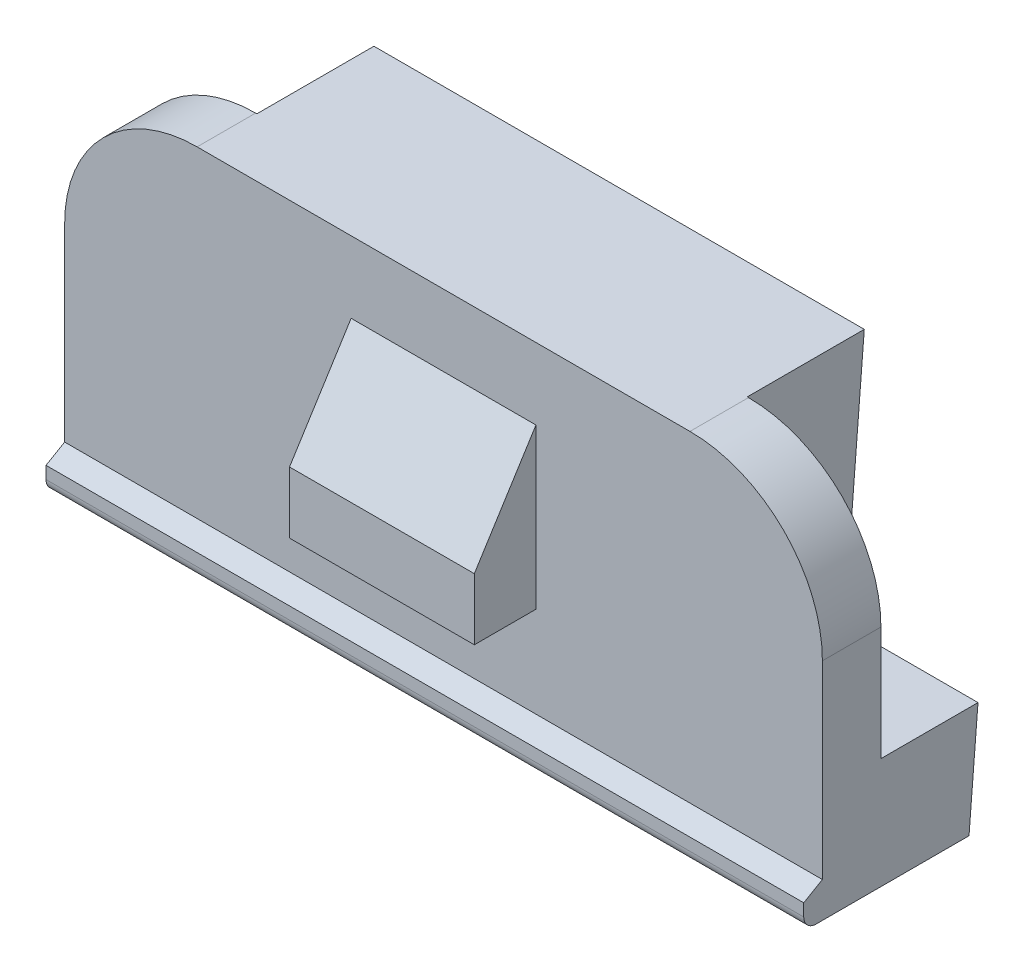
ISO-10303-21;
HEADER;
FILE_DESCRIPTION(('STEP AP214'),'2;1');
FILE_NAME('part.step','',(''),(''),'','','');
FILE_SCHEMA(('AUTOMOTIVE_DESIGN { 1 0 10303 214 1 1 1 1 }'));
ENDSEC;
DATA;
#1=APPLICATION_CONTEXT('core data for automotive mechanical design processes');
#2=APPLICATION_PROTOCOL_DEFINITION('international standard','automotive_design',2000,#1);
#3=PRODUCT_CONTEXT('',#1,'mechanical');
#4=PRODUCT('Part','Part','',(#3));
#5=PRODUCT_RELATED_PRODUCT_CATEGORY('part','',(#4));
#6=PRODUCT_DEFINITION_FORMATION('','',#4);
#7=PRODUCT_DEFINITION_CONTEXT('part definition',#1,'design');
#8=PRODUCT_DEFINITION('design','',#6,#7);
#9=PRODUCT_DEFINITION_SHAPE('','',#8);
#10=(LENGTH_UNIT() NAMED_UNIT(*) SI_UNIT(.MILLI.,.METRE.));
#11=(NAMED_UNIT(*) PLANE_ANGLE_UNIT() SI_UNIT($,.RADIAN.));
#12=(NAMED_UNIT(*) SI_UNIT($,.STERADIAN.) SOLID_ANGLE_UNIT());
#13=UNCERTAINTY_MEASURE_WITH_UNIT(LENGTH_MEASURE(1.E-05),#10,'distance_accuracy_value','');
#14=(GEOMETRIC_REPRESENTATION_CONTEXT(3) GLOBAL_UNCERTAINTY_ASSIGNED_CONTEXT((#13)) GLOBAL_UNIT_ASSIGNED_CONTEXT((#10,
#11,#12)) REPRESENTATION_CONTEXT('',''));
#15=CARTESIAN_POINT('',(0.,0.,0.));
#16=DIRECTION('',(0.,0.,1.));
#17=DIRECTION('',(1.,0.,0.));
#18=AXIS2_PLACEMENT_3D('',#15,#16,#17);
#19=CARTESIAN_POINT('',(12.3,0.574999999999999,-0.303108891324554));
#20=DIRECTION('',(0.,0.,-1.));
#21=DIRECTION('',(0.,1.,0.));
#22=AXIS2_PLACEMENT_3D('',#19,#20,#21);
#23=PLANE('',#22);
#24=DIRECTION('',(0.,-1.,0.));
#25=VECTOR('',#24,1.);
#26=CARTESIAN_POINT('',(12.3,0.574999999999999,-0.303108891324554));
#27=LINE('',#26,#25);
#28=CARTESIAN_POINT('',(12.3,3.65,-0.303108891324554));
#29=VERTEX_POINT('',#28);
#30=CARTESIAN_POINT('',(12.3,0.574999999999999,-0.303108891324554));
#31=VERTEX_POINT('',#30);
#32=EDGE_CURVE('E200',#29,#31,#27,.T.);
#33=ORIENTED_EDGE('',*,*,#32,.F.);
#34=CARTESIAN_POINT('',(10.15,3.65,-0.303108891324554));
#35=DIRECTION('',(0.,0.,-1.));
#36=DIRECTION('',(0.,1.,0.));
#37=AXIS2_PLACEMENT_3D('',#34,#35,#36);
#38=CIRCLE('',#37,2.15);
#39=CARTESIAN_POINT('',(10.15,5.8,-0.303108891324554));
#40=VERTEX_POINT('',#39);
#41=EDGE_CURVE('E215',#29,#40,#38,.F.);
#42=ORIENTED_EDGE('',*,*,#41,.T.);
#43=DIRECTION('',(-1.,0.,0.));
#44=VECTOR('',#43,1.);
#45=CARTESIAN_POINT('',(12.3,5.8,-0.303108891324554));
#46=LINE('',#45,#44);
#47=CARTESIAN_POINT('',(2.15,5.8,-0.303108891324554));
#48=VERTEX_POINT('',#47);
#49=EDGE_CURVE('E199',#40,#48,#46,.T.);
#50=ORIENTED_EDGE('',*,*,#49,.T.);
#51=CARTESIAN_POINT('',(2.15,3.65,-0.303108891324554));
#52=DIRECTION('',(0.,0.,-1.));
#53=DIRECTION('',(0.,1.,0.));
#54=AXIS2_PLACEMENT_3D('',#51,#52,#53);
#55=CIRCLE('',#54,2.15);
#56=CARTESIAN_POINT('',(0.,3.65,-0.303108891324554));
#57=VERTEX_POINT('',#56);
#58=EDGE_CURVE('E213',#48,#57,#55,.F.);
#59=ORIENTED_EDGE('',*,*,#58,.T.);
#60=DIRECTION('',(0.,-1.,0.));
#61=VECTOR('',#60,1.);
#62=CARTESIAN_POINT('',(0.,0.574999999999999,-0.303108891324554));
#63=LINE('',#62,#61);
#64=CARTESIAN_POINT('',(0.,0.574999999999999,-0.303108891324554));
#65=VERTEX_POINT('',#64);
#66=EDGE_CURVE('E187',#57,#65,#63,.T.);
#67=ORIENTED_EDGE('',*,*,#66,.T.);
#68=DIRECTION('',(-1.,0.,0.));
#69=VECTOR('',#68,1.);
#70=CARTESIAN_POINT('',(12.3,0.574999999999999,-0.303108891324554));
#71=LINE('',#70,#69);
#72=EDGE_CURVE('E196',#31,#65,#71,.T.);
#73=ORIENTED_EDGE('',*,*,#72,.F.);
#74=EDGE_LOOP('',(#33,#42,#50,#59,#67,#73));
#75=FACE_BOUND('',#74,.T.);
#76=DIRECTION('',(1.,0.,0.));
#77=VECTOR('',#76,1.);
#78=CARTESIAN_POINT('',(2.77167627923193,4.64,-0.303108891324554));
#79=LINE('',#78,#77);
#80=CARTESIAN_POINT('',(4.65,4.64,-0.303108891324554));
#81=VERTEX_POINT('',#80);
#82=CARTESIAN_POINT('',(7.65,4.64,-0.303108891324554));
#83=VERTEX_POINT('',#82);
#84=EDGE_CURVE('E317',#81,#83,#79,.T.);
#85=ORIENTED_EDGE('',*,*,#84,.T.);
#86=DIRECTION('',(0.,1.,0.));
#87=VECTOR('',#86,1.);
#88=CARTESIAN_POINT('',(7.65,3.05,-0.303108891324554));
#89=LINE('',#88,#87);
#90=CARTESIAN_POINT('',(7.65,2.05,-0.303108891324554));
#91=VERTEX_POINT('',#90);
#92=EDGE_CURVE('E306',#91,#83,#89,.T.);
#93=ORIENTED_EDGE('',*,*,#92,.F.);
#94=DIRECTION('',(1.,0.,0.));
#95=VECTOR('',#94,1.);
#96=CARTESIAN_POINT('',(4.65,2.05,-0.303108891324554));
#97=LINE('',#96,#95);
#98=CARTESIAN_POINT('',(4.65,2.05,-0.303108891324554));
#99=VERTEX_POINT('',#98);
#100=EDGE_CURVE('E55',#99,#91,#97,.T.);
#101=ORIENTED_EDGE('',*,*,#100,.F.);
#102=DIRECTION('',(0.,-1.,0.));
#103=VECTOR('',#102,1.);
#104=CARTESIAN_POINT('',(4.65,3.05,-0.303108891324554));
#105=LINE('',#104,#103);
#106=EDGE_CURVE('E304',#81,#99,#105,.T.);
#107=ORIENTED_EDGE('',*,*,#106,.F.);
#108=EDGE_LOOP('',(#85,#93,#101,#107));
#109=FACE_BOUND('',#108,.T.);
#110=ADVANCED_FACE('F33',(#75,#109),#23,.F.);
#111=CARTESIAN_POINT('',(12.3,0.4,0.));
#112=DIRECTION('',(0.,-0.86602540378444,-0.499999999999998));
#113=DIRECTION('',(0.,0.499999999999998,-0.86602540378444));
#114=AXIS2_PLACEMENT_3D('',#111,#112,#113);
#115=PLANE('',#114);
#116=DIRECTION('',(0.,-0.499999999999998,0.86602540378444));
#117=VECTOR('',#116,1.);
#118=CARTESIAN_POINT('',(0.,0.4,0.));
#119=LINE('',#118,#117);
#120=CARTESIAN_POINT('',(0.,0.4,0.));
#121=VERTEX_POINT('',#120);
#122=EDGE_CURVE('E253',#65,#121,#119,.T.);
#123=ORIENTED_EDGE('',*,*,#122,.T.);
#124=DIRECTION('',(-1.,0.,0.));
#125=VECTOR('',#124,1.);
#126=CARTESIAN_POINT('',(12.3,0.4,0.));
#127=LINE('',#126,#125);
#128=CARTESIAN_POINT('',(12.3,0.4,0.));
#129=VERTEX_POINT('',#128);
#130=EDGE_CURVE('E207',#129,#121,#127,.T.);
#131=ORIENTED_EDGE('',*,*,#130,.F.);
#132=DIRECTION('',(0.,-0.499999999999998,0.86602540378444));
#133=VECTOR('',#132,1.);
#134=CARTESIAN_POINT('',(12.3,0.4,0.));
#135=LINE('',#134,#133);
#136=EDGE_CURVE('E190',#31,#129,#135,.T.);
#137=ORIENTED_EDGE('',*,*,#136,.F.);
#138=ORIENTED_EDGE('',*,*,#72,.T.);
#139=EDGE_LOOP('',(#123,#131,#137,#138));
#140=FACE_BOUND('',#139,.T.);
#141=ADVANCED_FACE('F350',(#140),#115,.F.);
#142=CARTESIAN_POINT('',(12.3,0.200000000000001,0.));
#143=DIRECTION('',(0.,0.,-1.));
#144=DIRECTION('',(-1.,0.,0.));
#145=AXIS2_PLACEMENT_3D('',#142,#143,#144);
#146=PLANE('',#145);
#147=DIRECTION('',(0.,-1.,0.));
#148=VECTOR('',#147,1.);
#149=CARTESIAN_POINT('',(0.,0.200000000000001,0.));
#150=LINE('',#149,#148);
#151=CARTESIAN_POINT('',(0.,0.200000000000001,0.));
#152=VERTEX_POINT('',#151);
#153=EDGE_CURVE('E192',#121,#152,#150,.T.);
#154=ORIENTED_EDGE('',*,*,#153,.T.);
#155=DIRECTION('',(-1.,0.,0.));
#156=VECTOR('',#155,1.);
#157=CARTESIAN_POINT('',(12.3,0.200000000000001,0.));
#158=LINE('',#157,#156);
#159=CARTESIAN_POINT('',(12.3,0.200000000000001,0.));
#160=VERTEX_POINT('',#159);
#161=EDGE_CURVE('E204',#160,#152,#158,.T.);
#162=ORIENTED_EDGE('',*,*,#161,.F.);
#163=DIRECTION('',(0.,-1.,0.));
#164=VECTOR('',#163,1.);
#165=CARTESIAN_POINT('',(12.3,0.200000000000001,0.));
#166=LINE('',#165,#164);
#167=EDGE_CURVE('E265',#129,#160,#166,.T.);
#168=ORIENTED_EDGE('',*,*,#167,.F.);
#169=ORIENTED_EDGE('',*,*,#130,.T.);
#170=EDGE_LOOP('',(#154,#162,#168,#169));
#171=FACE_BOUND('',#170,.T.);
#172=ADVANCED_FACE('F354',(#171),#146,.F.);
#173=CARTESIAN_POINT('',(12.3,0.2,-0.2));
#174=DIRECTION('',(-1.,0.,0.));
#175=DIRECTION('',(0.,0.,1.));
#176=AXIS2_PLACEMENT_3D('',#173,#174,#175);
#177=CYLINDRICAL_SURFACE('',#176,0.2);
#178=CARTESIAN_POINT('',(0.,0.2,-0.2));
#179=DIRECTION('',(1.,0.,0.));
#180=DIRECTION('',(0.,0.,-1.));
#181=AXIS2_PLACEMENT_3D('',#178,#179,#180);
#182=CIRCLE('',#181,0.2);
#183=CARTESIAN_POINT('',(0.,0.,-0.200000000000001));
#184=VERTEX_POINT('',#183);
#185=EDGE_CURVE('E188',#152,#184,#182,.T.);
#186=ORIENTED_EDGE('',*,*,#185,.T.);
#187=DIRECTION('',(-1.,0.,0.));
#188=VECTOR('',#187,1.);
#189=CARTESIAN_POINT('',(12.3,0.,-0.200000000000001));
#190=LINE('',#189,#188);
#191=CARTESIAN_POINT('',(12.3,0.,-0.200000000000001));
#192=VERTEX_POINT('',#191);
#193=EDGE_CURVE('E186',#192,#184,#190,.T.);
#194=ORIENTED_EDGE('',*,*,#193,.F.);
#195=CARTESIAN_POINT('',(12.3,0.2,-0.2));
#196=DIRECTION('',(1.,0.,0.));
#197=DIRECTION('',(0.,0.,-1.));
#198=AXIS2_PLACEMENT_3D('',#195,#196,#197);
#199=CIRCLE('',#198,0.2);
#200=EDGE_CURVE('E263',#160,#192,#199,.T.);
#201=ORIENTED_EDGE('',*,*,#200,.F.);
#202=ORIENTED_EDGE('',*,*,#161,.T.);
#203=EDGE_LOOP('',(#186,#194,#201,#202));
#204=FACE_BOUND('',#203,.T.);
#205=ADVANCED_FACE('F356',(#204),#177,.T.);
#206=CARTESIAN_POINT('',(12.3,0.,-3.30310889132455));
#207=DIRECTION('',(0.,1.,0.));
#208=DIRECTION('',(0.,0.,1.));
#209=AXIS2_PLACEMENT_3D('',#206,#207,#208);
#210=PLANE('',#209);
#211=DIRECTION('',(0.,0.,-1.));
#212=VECTOR('',#211,1.);
#213=CARTESIAN_POINT('',(0.,0.,-3.30310889132455));
#214=LINE('',#213,#212);
#215=CARTESIAN_POINT('',(0.,0.,-2.68310889132455));
#216=VERTEX_POINT('',#215);
#217=EDGE_CURVE('E179',#184,#216,#214,.T.);
#218=ORIENTED_EDGE('',*,*,#217,.T.);
#219=DIRECTION('',(1.,0.,0.));
#220=VECTOR('',#219,1.);
#221=CARTESIAN_POINT('',(0.,0.,-2.68310889132455));
#222=LINE('',#221,#220);
#223=CARTESIAN_POINT('',(12.3,0.,-2.68310889132455));
#224=VERTEX_POINT('',#223);
#225=EDGE_CURVE('E161',#216,#224,#222,.T.);
#226=ORIENTED_EDGE('',*,*,#225,.T.);
#227=DIRECTION('',(0.,0.,-1.));
#228=VECTOR('',#227,1.);
#229=CARTESIAN_POINT('',(12.3,0.,-3.30310889132455));
#230=LINE('',#229,#228);
#231=EDGE_CURVE('E261',#192,#224,#230,.T.);
#232=ORIENTED_EDGE('',*,*,#231,.F.);
#233=ORIENTED_EDGE('',*,*,#193,.T.);
#234=EDGE_LOOP('',(#218,#226,#232,#233));
#235=FACE_BOUND('',#234,.T.);
#236=ADVANCED_FACE('F184',(#235),#210,.F.);
#237=CARTESIAN_POINT('',(12.3,5.8,-0.303108891324554));
#238=DIRECTION('',(0.,-1.,0.));
#239=DIRECTION('',(0.,0.,-1.));
#240=AXIS2_PLACEMENT_3D('',#237,#238,#239);
#241=PLANE('',#240);
#242=DIRECTION('',(0.,0.,1.));
#243=VECTOR('',#242,1.);
#244=CARTESIAN_POINT('',(10.13,5.8,-3.30310889132455));
#245=LINE('',#244,#243);
#246=CARTESIAN_POINT('',(10.13,5.8,-3.15310889132455));
#247=VERTEX_POINT('',#246);
#248=CARTESIAN_POINT('',(10.13,5.8,-1.25310889132455));
#249=VERTEX_POINT('',#248);
#250=EDGE_CURVE('E288',#247,#249,#245,.T.);
#251=ORIENTED_EDGE('',*,*,#250,.F.);
#252=DIRECTION('',(1.,0.,0.));
#253=VECTOR('',#252,1.);
#254=CARTESIAN_POINT('',(0.,5.8,-3.15310889132455));
#255=LINE('',#254,#253);
#256=CARTESIAN_POINT('',(2.17,5.8,-3.15310889132455));
#257=VERTEX_POINT('',#256);
#258=EDGE_CURVE('E172',#257,#247,#255,.T.);
#259=ORIENTED_EDGE('',*,*,#258,.F.);
#260=DIRECTION('',(0.,0.,-1.));
#261=VECTOR('',#260,1.);
#262=CARTESIAN_POINT('',(2.17,5.8,-3.30310889132455));
#263=LINE('',#262,#261);
#264=CARTESIAN_POINT('',(2.17,5.8,-1.25310889132455));
#265=VERTEX_POINT('',#264);
#266=EDGE_CURVE('E244',#265,#257,#263,.T.);
#267=ORIENTED_EDGE('',*,*,#266,.F.);
#268=DIRECTION('',(1.,0.,0.));
#269=VECTOR('',#268,1.);
#270=CARTESIAN_POINT('',(0.,5.8,-1.25310889132455));
#271=LINE('',#270,#269);
#272=CARTESIAN_POINT('',(2.15,5.8,-1.25310889132455));
#273=VERTEX_POINT('',#272);
#274=EDGE_CURVE('E230',#273,#265,#271,.T.);
#275=ORIENTED_EDGE('',*,*,#274,.F.);
#276=DIRECTION('',(0.,0.,1.));
#277=VECTOR('',#276,1.);
#278=CARTESIAN_POINT('',(2.15,5.8,-0.303108891324554));
#279=LINE('',#278,#277);
#280=EDGE_CURVE('E217',#273,#48,#279,.T.);
#281=ORIENTED_EDGE('',*,*,#280,.T.);
#282=ORIENTED_EDGE('',*,*,#49,.F.);
#283=DIRECTION('',(0.,0.,1.));
#284=VECTOR('',#283,1.);
#285=CARTESIAN_POINT('',(10.15,5.8,-1.25310889132455));
#286=LINE('',#285,#284);
#287=CARTESIAN_POINT('',(10.15,5.8,-1.25310889132455));
#288=VERTEX_POINT('',#287);
#289=EDGE_CURVE('E220',#40,#288,#286,.F.);
#290=ORIENTED_EDGE('',*,*,#289,.T.);
#291=DIRECTION('',(1.,0.,0.));
#292=VECTOR('',#291,1.);
#293=CARTESIAN_POINT('',(12.3,5.8,-1.25310889132455));
#294=LINE('',#293,#292);
#295=EDGE_CURVE('E284',#249,#288,#294,.T.);
#296=ORIENTED_EDGE('',*,*,#295,.F.);
#297=EDGE_LOOP('',(#251,#259,#267,#275,#281,#282,#290,#296));
#298=FACE_BOUND('',#297,.T.);
#299=ADVANCED_FACE('F240',(#298),#241,.F.);
#300=CARTESIAN_POINT('',(12.3,0.2,-0.2));
#301=DIRECTION('',(1.,0.,0.));
#302=DIRECTION('',(0.,0.,-1.));
#303=AXIS2_PLACEMENT_3D('',#300,#301,#302);
#304=PLANE('',#303);
#305=DIRECTION('',(0.,-0.9967327883488,0.0807697259524028));
#306=VECTOR('',#305,1.);
#307=CARTESIAN_POINT('',(12.3,0.,-2.68310889132455));
#308=LINE('',#307,#306);
#309=CARTESIAN_POINT('',(12.3,1.8,-2.82897096029007));
#310=VERTEX_POINT('',#309);
#311=EDGE_CURVE('E167',#310,#224,#308,.T.);
#312=ORIENTED_EDGE('',*,*,#311,.F.);
#313=DIRECTION('',(0.,0.,-1.));
#314=VECTOR('',#313,1.);
#315=CARTESIAN_POINT('',(12.3,1.8,-3.30310889132455));
#316=LINE('',#315,#314);
#317=CARTESIAN_POINT('',(12.3,1.8,-1.25310889132455));
#318=VERTEX_POINT('',#317);
#319=EDGE_CURVE('E287',#318,#310,#316,.T.);
#320=ORIENTED_EDGE('',*,*,#319,.F.);
#321=DIRECTION('',(0.,1.,0.));
#322=VECTOR('',#321,1.);
#323=CARTESIAN_POINT('',(12.3,1.8,-1.25310889132455));
#324=LINE('',#323,#322);
#325=CARTESIAN_POINT('',(12.3,3.65,-1.25310889132455));
#326=VERTEX_POINT('',#325);
#327=EDGE_CURVE('E245',#318,#326,#324,.T.);
#328=ORIENTED_EDGE('',*,*,#327,.T.);
#329=DIRECTION('',(0.,0.,1.));
#330=VECTOR('',#329,1.);
#331=CARTESIAN_POINT('',(12.3,3.65,-0.303108891324554));
#332=LINE('',#331,#330);
#333=EDGE_CURVE('E210',#326,#29,#332,.T.);
#334=ORIENTED_EDGE('',*,*,#333,.T.);
#335=ORIENTED_EDGE('',*,*,#32,.T.);
#336=ORIENTED_EDGE('',*,*,#136,.T.);
#337=ORIENTED_EDGE('',*,*,#167,.T.);
#338=ORIENTED_EDGE('',*,*,#200,.T.);
#339=ORIENTED_EDGE('',*,*,#231,.T.);
#340=EDGE_LOOP('',(#312,#320,#328,#334,#335,#336,#337,#338,#339));
#341=FACE_BOUND('',#340,.T.);
#342=ADVANCED_FACE('F347',(#341),#304,.T.);
#343=CARTESIAN_POINT('',(0.,0.2,-0.2));
#344=DIRECTION('',(1.,0.,0.));
#345=DIRECTION('',(0.,0.,-1.));
#346=AXIS2_PLACEMENT_3D('',#343,#344,#345);
#347=PLANE('',#346);
#348=DIRECTION('',(0.,0.,1.));
#349=VECTOR('',#348,1.);
#350=CARTESIAN_POINT('',(0.,1.8,-3.30310889132455));
#351=LINE('',#350,#349);
#352=CARTESIAN_POINT('',(0.,1.8,-2.82897096029007));
#353=VERTEX_POINT('',#352);
#354=CARTESIAN_POINT('',(0.,1.8,-1.25310889132455));
#355=VERTEX_POINT('',#354);
#356=EDGE_CURVE('E181',#353,#355,#351,.T.);
#357=ORIENTED_EDGE('',*,*,#356,.F.);
#358=DIRECTION('',(0.,-0.9967327883488,0.0807697259524028));
#359=VECTOR('',#358,1.);
#360=CARTESIAN_POINT('',(0.,0.,-2.68310889132455));
#361=LINE('',#360,#359);
#362=EDGE_CURVE('E164',#353,#216,#361,.T.);
#363=ORIENTED_EDGE('',*,*,#362,.T.);
#364=ORIENTED_EDGE('',*,*,#217,.F.);
#365=ORIENTED_EDGE('',*,*,#185,.F.);
#366=ORIENTED_EDGE('',*,*,#153,.F.);
#367=ORIENTED_EDGE('',*,*,#122,.F.);
#368=ORIENTED_EDGE('',*,*,#66,.F.);
#369=DIRECTION('',(0.,0.,1.));
#370=VECTOR('',#369,1.);
#371=CARTESIAN_POINT('',(0.,3.65,-0.2));
#372=LINE('',#371,#370);
#373=CARTESIAN_POINT('',(0.,3.65,-1.25310889132455));
#374=VERTEX_POINT('',#373);
#375=EDGE_CURVE('E224',#57,#374,#372,.F.);
#376=ORIENTED_EDGE('',*,*,#375,.T.);
#377=DIRECTION('',(0.,1.,0.));
#378=VECTOR('',#377,1.);
#379=CARTESIAN_POINT('',(0.,1.8,-1.25310889132455));
#380=LINE('',#379,#378);
#381=EDGE_CURVE('E233',#355,#374,#380,.T.);
#382=ORIENTED_EDGE('',*,*,#381,.F.);
#383=EDGE_LOOP('',(#357,#363,#364,#365,#366,#367,#368,#376,#382));
#384=FACE_BOUND('',#383,.T.);
#385=ADVANCED_FACE('F177',(#384),#347,.F.);
#386=CARTESIAN_POINT('',(2.17,1.8,-3.30310889132455));
#387=DIRECTION('',(1.,0.,0.));
#388=DIRECTION('',(0.,0.,-1.));
#389=AXIS2_PLACEMENT_3D('',#386,#387,#388);
#390=PLANE('',#389);
#391=ORIENTED_EDGE('',*,*,#266,.T.);
#392=DIRECTION('',(0.,-0.9967327883488,0.0807697259524028));
#393=VECTOR('',#392,1.);
#394=CARTESIAN_POINT('',(2.17,1.83817086964611,-2.83206411696829));
#395=LINE('',#394,#393);
#396=CARTESIAN_POINT('',(2.17,1.8,-2.82897096029007));
#397=VERTEX_POINT('',#396);
#398=EDGE_CURVE('E323',#257,#397,#395,.T.);
#399=ORIENTED_EDGE('',*,*,#398,.T.);
#400=DIRECTION('',(0.,0.,-1.));
#401=VECTOR('',#400,1.);
#402=CARTESIAN_POINT('',(2.17,1.8,-3.30310889132455));
#403=LINE('',#402,#401);
#404=CARTESIAN_POINT('',(2.17,1.8,-1.25310889132455));
#405=VERTEX_POINT('',#404);
#406=EDGE_CURVE('E269',#405,#397,#403,.T.);
#407=ORIENTED_EDGE('',*,*,#406,.F.);
#408=DIRECTION('',(0.,1.,0.));
#409=VECTOR('',#408,1.);
#410=CARTESIAN_POINT('',(2.17,1.8,-1.25310889132455));
#411=LINE('',#410,#409);
#412=EDGE_CURVE('E256',#405,#265,#411,.T.);
#413=ORIENTED_EDGE('',*,*,#412,.T.);
#414=EDGE_LOOP('',(#391,#399,#407,#413));
#415=FACE_BOUND('',#414,.T.);
#416=ADVANCED_FACE('F413',(#415),#390,.F.);
#417=CARTESIAN_POINT('',(0.,1.8,-1.25310889132455));
#418=DIRECTION('',(0.,0.,1.));
#419=DIRECTION('',(1.,0.,0.));
#420=AXIS2_PLACEMENT_3D('',#417,#418,#419);
#421=PLANE('',#420);
#422=ORIENTED_EDGE('',*,*,#381,.T.);
#423=CARTESIAN_POINT('',(2.15,3.65,-1.25310889132455));
#424=DIRECTION('',(0.,0.,1.));
#425=DIRECTION('',(1.,0.,0.));
#426=AXIS2_PLACEMENT_3D('',#423,#424,#425);
#427=CIRCLE('',#426,2.15);
#428=EDGE_CURVE('E41',#374,#273,#427,.F.);
#429=ORIENTED_EDGE('',*,*,#428,.T.);
#430=ORIENTED_EDGE('',*,*,#274,.T.);
#431=ORIENTED_EDGE('',*,*,#412,.F.);
#432=DIRECTION('',(1.,0.,0.));
#433=VECTOR('',#432,1.);
#434=CARTESIAN_POINT('',(0.,1.8,-1.25310889132455));
#435=LINE('',#434,#433);
#436=EDGE_CURVE('E274',#355,#405,#435,.T.);
#437=ORIENTED_EDGE('',*,*,#436,.F.);
#438=EDGE_LOOP('',(#422,#429,#430,#431,#437));
#439=FACE_BOUND('',#438,.T.);
#440=ADVANCED_FACE('F229',(#439),#421,.F.);
#441=CARTESIAN_POINT('',(0.,1.8,0.));
#442=DIRECTION('',(0.,1.,0.));
#443=DIRECTION('',(0.,0.,1.));
#444=AXIS2_PLACEMENT_3D('',#441,#442,#443);
#445=PLANE('',#444);
#446=DIRECTION('',(1.,0.,0.));
#447=VECTOR('',#446,1.);
#448=CARTESIAN_POINT('',(0.,1.8,-2.82897096029007));
#449=LINE('',#448,#447);
#450=EDGE_CURVE('E328',#353,#397,#449,.T.);
#451=ORIENTED_EDGE('',*,*,#450,.F.);
#452=ORIENTED_EDGE('',*,*,#356,.T.);
#453=ORIENTED_EDGE('',*,*,#436,.T.);
#454=ORIENTED_EDGE('',*,*,#406,.T.);
#455=EDGE_LOOP('',(#451,#452,#453,#454));
#456=FACE_BOUND('',#455,.T.);
#457=ADVANCED_FACE('F426',(#456),#445,.T.);
#458=CARTESIAN_POINT('',(12.3,1.8,-1.25310889132455));
#459=DIRECTION('',(0.,0.,1.));
#460=DIRECTION('',(1.,0.,0.));
#461=AXIS2_PLACEMENT_3D('',#458,#459,#460);
#462=PLANE('',#461);
#463=ORIENTED_EDGE('',*,*,#295,.T.);
#464=CARTESIAN_POINT('',(10.15,3.65,-1.25310889132455));
#465=DIRECTION('',(0.,0.,1.));
#466=DIRECTION('',(1.,0.,0.));
#467=AXIS2_PLACEMENT_3D('',#464,#465,#466);
#468=CIRCLE('',#467,2.15);
#469=EDGE_CURVE('E222',#288,#326,#468,.F.);
#470=ORIENTED_EDGE('',*,*,#469,.T.);
#471=ORIENTED_EDGE('',*,*,#327,.F.);
#472=DIRECTION('',(1.,0.,0.));
#473=VECTOR('',#472,1.);
#474=CARTESIAN_POINT('',(12.3,1.8,-1.25310889132455));
#475=LINE('',#474,#473);
#476=CARTESIAN_POINT('',(10.13,1.8,-1.25310889132455));
#477=VERTEX_POINT('',#476);
#478=EDGE_CURVE('E281',#477,#318,#475,.T.);
#479=ORIENTED_EDGE('',*,*,#478,.F.);
#480=DIRECTION('',(0.,1.,0.));
#481=VECTOR('',#480,1.);
#482=CARTESIAN_POINT('',(10.13,1.8,-1.25310889132455));
#483=LINE('',#482,#481);
#484=EDGE_CURVE('E278',#477,#249,#483,.T.);
#485=ORIENTED_EDGE('',*,*,#484,.T.);
#486=EDGE_LOOP('',(#463,#470,#471,#479,#485));
#487=FACE_BOUND('',#486,.T.);
#488=ADVANCED_FACE('F340',(#487),#462,.F.);
#489=CARTESIAN_POINT('',(10.13,1.8,-3.30310889132455));
#490=DIRECTION('',(-1.,0.,0.));
#491=DIRECTION('',(0.,0.,1.));
#492=AXIS2_PLACEMENT_3D('',#489,#490,#491);
#493=PLANE('',#492);
#494=DIRECTION('',(0.,0.,1.));
#495=VECTOR('',#494,1.);
#496=CARTESIAN_POINT('',(10.13,1.8,-3.30310889132455));
#497=LINE('',#496,#495);
#498=CARTESIAN_POINT('',(10.13,1.8,-2.82897096029007));
#499=VERTEX_POINT('',#498);
#500=EDGE_CURVE('E292',#499,#477,#497,.T.);
#501=ORIENTED_EDGE('',*,*,#500,.F.);
#502=DIRECTION('',(0.,0.9967327883488,-0.0807697259524028));
#503=VECTOR('',#502,1.);
#504=CARTESIAN_POINT('',(10.13,1.83817086964611,-2.83206411696829));
#505=LINE('',#504,#503);
#506=EDGE_CURVE('E48',#499,#247,#505,.T.);
#507=ORIENTED_EDGE('',*,*,#506,.T.);
#508=ORIENTED_EDGE('',*,*,#250,.T.);
#509=ORIENTED_EDGE('',*,*,#484,.F.);
#510=EDGE_LOOP('',(#501,#507,#508,#509));
#511=FACE_BOUND('',#510,.T.);
#512=ADVANCED_FACE('F334',(#511),#493,.F.);
#513=CARTESIAN_POINT('',(0.,1.8,0.));
#514=DIRECTION('',(0.,-1.,0.));
#515=DIRECTION('',(0.,0.,-1.));
#516=AXIS2_PLACEMENT_3D('',#513,#514,#515);
#517=PLANE('',#516);
#518=ORIENTED_EDGE('',*,*,#319,.T.);
#519=DIRECTION('',(-1.,0.,0.));
#520=VECTOR('',#519,1.);
#521=CARTESIAN_POINT('',(0.,1.8,-2.82897096029007));
#522=LINE('',#521,#520);
#523=EDGE_CURVE('E11',#310,#499,#522,.T.);
#524=ORIENTED_EDGE('',*,*,#523,.T.);
#525=ORIENTED_EDGE('',*,*,#500,.T.);
#526=ORIENTED_EDGE('',*,*,#478,.T.);
#527=EDGE_LOOP('',(#518,#524,#525,#526));
#528=FACE_BOUND('',#527,.T.);
#529=ADVANCED_FACE('F358',(#528),#517,.F.);
#530=CARTESIAN_POINT('',(10.15,3.65,-0.2));
#531=DIRECTION('',(0.,0.,-1.));
#532=DIRECTION('',(-1.,0.,0.));
#533=AXIS2_PLACEMENT_3D('',#530,#531,#532);
#534=CYLINDRICAL_SURFACE('',#533,2.15);
#535=ORIENTED_EDGE('',*,*,#469,.F.);
#536=ORIENTED_EDGE('',*,*,#289,.F.);
#537=ORIENTED_EDGE('',*,*,#41,.F.);
#538=ORIENTED_EDGE('',*,*,#333,.F.);
#539=EDGE_LOOP('',(#535,#536,#537,#538));
#540=FACE_BOUND('',#539,.T.);
#541=ADVANCED_FACE('F345',(#540),#534,.T.);
#542=CARTESIAN_POINT('',(2.15,3.65,-0.303108891324554));
#543=DIRECTION('',(0.,0.,1.));
#544=DIRECTION('',(1.,0.,0.));
#545=AXIS2_PLACEMENT_3D('',#542,#543,#544);
#546=CYLINDRICAL_SURFACE('',#545,2.15);
#547=ORIENTED_EDGE('',*,*,#428,.F.);
#548=ORIENTED_EDGE('',*,*,#375,.F.);
#549=ORIENTED_EDGE('',*,*,#58,.F.);
#550=ORIENTED_EDGE('',*,*,#280,.F.);
#551=EDGE_LOOP('',(#547,#548,#549,#550));
#552=FACE_BOUND('',#551,.T.);
#553=ADVANCED_FACE('F35',(#552),#546,.T.);
#554=CARTESIAN_POINT('',(7.65,3.05,0.696891108675446));
#555=DIRECTION('',(-1.,0.,0.));
#556=DIRECTION('',(0.,0.,1.));
#557=AXIS2_PLACEMENT_3D('',#554,#555,#556);
#558=PLANE('',#557);
#559=ORIENTED_EDGE('',*,*,#92,.T.);
#560=DIRECTION('',(0.,-0.846499451835614,0.532389592349442));
#561=VECTOR('',#560,1.);
#562=CARTESIAN_POINT('',(7.65,4.64,-0.303108891324554));
#563=LINE('',#562,#561);
#564=CARTESIAN_POINT('',(7.65,3.05,0.696891108675446));
#565=VERTEX_POINT('',#564);
#566=EDGE_CURVE('E320',#83,#565,#563,.T.);
#567=ORIENTED_EDGE('',*,*,#566,.T.);
#568=DIRECTION('',(0.,1.,0.));
#569=VECTOR('',#568,1.);
#570=CARTESIAN_POINT('',(7.65,3.05,0.696891108675446));
#571=LINE('',#570,#569);
#572=CARTESIAN_POINT('',(7.65,2.05,0.696891108675446));
#573=VERTEX_POINT('',#572);
#574=EDGE_CURVE('E303',#573,#565,#571,.T.);
#575=ORIENTED_EDGE('',*,*,#574,.F.);
#576=DIRECTION('',(0.,0.,-1.));
#577=VECTOR('',#576,1.);
#578=CARTESIAN_POINT('',(7.65,2.05,0.696891108675446));
#579=LINE('',#578,#577);
#580=EDGE_CURVE('E298',#573,#91,#579,.T.);
#581=ORIENTED_EDGE('',*,*,#580,.T.);
#582=EDGE_LOOP('',(#559,#567,#575,#581));
#583=FACE_BOUND('',#582,.T.);
#584=ADVANCED_FACE('F489',(#583),#558,.F.);
#585=CARTESIAN_POINT('',(4.65,3.05,0.696891108675446));
#586=DIRECTION('',(1.,0.,0.));
#587=DIRECTION('',(0.,0.,-1.));
#588=AXIS2_PLACEMENT_3D('',#585,#586,#587);
#589=PLANE('',#588);
#590=ORIENTED_EDGE('',*,*,#106,.T.);
#591=DIRECTION('',(0.,0.,-1.));
#592=VECTOR('',#591,1.);
#593=CARTESIAN_POINT('',(4.65,2.05,0.696891108675446));
#594=LINE('',#593,#592);
#595=CARTESIAN_POINT('',(4.65,2.05,0.696891108675446));
#596=VERTEX_POINT('',#595);
#597=EDGE_CURVE('E290',#596,#99,#594,.T.);
#598=ORIENTED_EDGE('',*,*,#597,.F.);
#599=DIRECTION('',(0.,-1.,0.));
#600=VECTOR('',#599,1.);
#601=CARTESIAN_POINT('',(4.65,3.05,0.696891108675446));
#602=LINE('',#601,#600);
#603=CARTESIAN_POINT('',(4.65,3.05,0.696891108675446));
#604=VERTEX_POINT('',#603);
#605=EDGE_CURVE('E310',#604,#596,#602,.T.);
#606=ORIENTED_EDGE('',*,*,#605,.F.);
#607=DIRECTION('',(0.,0.846499451835614,-0.532389592349442));
#608=VECTOR('',#607,1.);
#609=CARTESIAN_POINT('',(4.65,4.64,-0.303108891324554));
#610=LINE('',#609,#608);
#611=EDGE_CURVE('E308',#604,#81,#610,.T.);
#612=ORIENTED_EDGE('',*,*,#611,.T.);
#613=EDGE_LOOP('',(#590,#598,#606,#612));
#614=FACE_BOUND('',#613,.T.);
#615=ADVANCED_FACE('F481',(#614),#589,.F.);
#616=CARTESIAN_POINT('',(4.65,2.05,0.696891108675446));
#617=DIRECTION('',(0.,1.,0.));
#618=DIRECTION('',(0.,0.,1.));
#619=AXIS2_PLACEMENT_3D('',#616,#617,#618);
#620=PLANE('',#619);
#621=ORIENTED_EDGE('',*,*,#100,.T.);
#622=ORIENTED_EDGE('',*,*,#580,.F.);
#623=DIRECTION('',(1.,0.,0.));
#624=VECTOR('',#623,1.);
#625=CARTESIAN_POINT('',(4.65,2.05,0.696891108675446));
#626=LINE('',#625,#624);
#627=EDGE_CURVE('E301',#596,#573,#626,.T.);
#628=ORIENTED_EDGE('',*,*,#627,.F.);
#629=ORIENTED_EDGE('',*,*,#597,.T.);
#630=EDGE_LOOP('',(#621,#622,#628,#629));
#631=FACE_BOUND('',#630,.T.);
#632=ADVANCED_FACE('F472',(#631),#620,.F.);
#633=CARTESIAN_POINT('',(0.,0.,0.696891108675446));
#634=DIRECTION('',(0.,0.,1.));
#635=DIRECTION('',(1.,0.,0.));
#636=AXIS2_PLACEMENT_3D('',#633,#634,#635);
#637=PLANE('',#636);
#638=ORIENTED_EDGE('',*,*,#574,.T.);
#639=DIRECTION('',(-1.,0.,0.));
#640=VECTOR('',#639,1.);
#641=CARTESIAN_POINT('',(4.65,3.05,0.696891108675446));
#642=LINE('',#641,#640);
#643=EDGE_CURVE('E312',#565,#604,#642,.T.);
#644=ORIENTED_EDGE('',*,*,#643,.T.);
#645=ORIENTED_EDGE('',*,*,#605,.T.);
#646=ORIENTED_EDGE('',*,*,#627,.T.);
#647=EDGE_LOOP('',(#638,#644,#645,#646));
#648=FACE_BOUND('',#647,.T.);
#649=ADVANCED_FACE('F465',(#648),#637,.T.);
#650=CARTESIAN_POINT('',(2.77167627923193,4.64,-0.303108891324554));
#651=DIRECTION('',(0.,0.532389592349442,0.846499451835614));
#652=DIRECTION('',(0.,-0.846499451835614,0.532389592349442));
#653=AXIS2_PLACEMENT_3D('',#650,#651,#652);
#654=PLANE('',#653);
#655=ORIENTED_EDGE('',*,*,#611,.F.);
#656=ORIENTED_EDGE('',*,*,#643,.F.);
#657=ORIENTED_EDGE('',*,*,#566,.F.);
#658=ORIENTED_EDGE('',*,*,#84,.F.);
#659=EDGE_LOOP('',(#655,#656,#657,#658));
#660=FACE_BOUND('',#659,.T.);
#661=ADVANCED_FACE('F456',(#660),#654,.T.);
#662=CARTESIAN_POINT('',(0.,0.,-2.68310889132455));
#663=DIRECTION('',(0.,0.0807697259524028,0.9967327883488));
#664=DIRECTION('',(0.,-0.9967327883488,0.0807697259524028));
#665=AXIS2_PLACEMENT_3D('',#662,#663,#664);
#666=PLANE('',#665);
#667=ORIENTED_EDGE('',*,*,#258,.T.);
#668=ORIENTED_EDGE('',*,*,#506,.F.);
#669=ORIENTED_EDGE('',*,*,#523,.F.);
#670=ORIENTED_EDGE('',*,*,#311,.T.);
#671=ORIENTED_EDGE('',*,*,#225,.F.);
#672=ORIENTED_EDGE('',*,*,#362,.F.);
#673=ORIENTED_EDGE('',*,*,#450,.T.);
#674=ORIENTED_EDGE('',*,*,#398,.F.);
#675=EDGE_LOOP('',(#667,#668,#669,#670,#671,#672,#673,#674));
#676=FACE_BOUND('',#675,.T.);
#677=ADVANCED_FACE('F163',(#676),#666,.F.);
#678=CLOSED_SHELL('',(#110,#141,#172,#205,#236,#299,#342,#385,#416,#440,#457,#488,#512,#529,
#541,#553,#584,#615,#632,#649,#661,#677));
#679=MANIFOLD_SOLID_BREP('B2',#678);
#680=ADVANCED_BREP_SHAPE_REPRESENTATION('',(#18,#679),#14);
#681=SHAPE_DEFINITION_REPRESENTATION(#9,#680);
ENDSEC;
END-ISO-10303-21;
